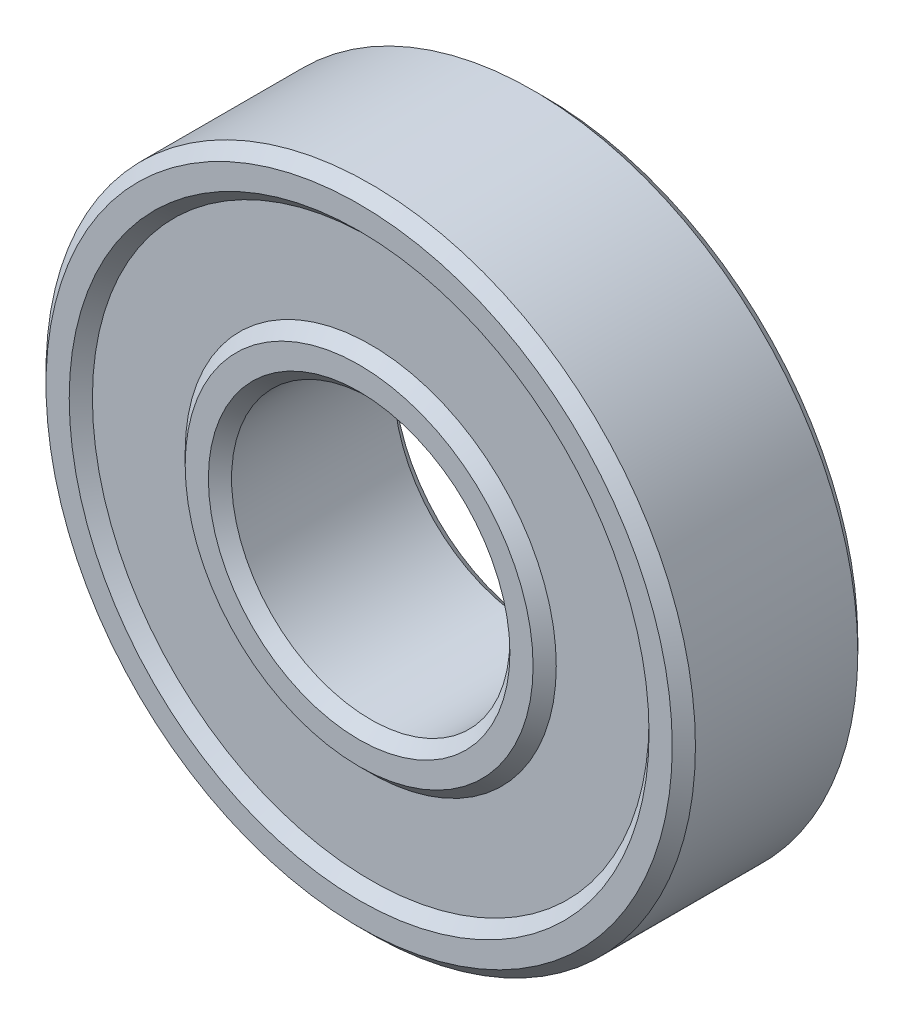
ISO-10303-21;
HEADER;
FILE_DESCRIPTION(('STEP AP214'),'2;1');
FILE_NAME('part.step','',(''),(''),'','','');
FILE_SCHEMA(('AUTOMOTIVE_DESIGN { 1 0 10303 214 1 1 1 1 }'));
ENDSEC;
DATA;
#1=APPLICATION_CONTEXT('core data for automotive mechanical design processes');
#2=APPLICATION_PROTOCOL_DEFINITION('international standard','automotive_design',2000,#1);
#3=PRODUCT_CONTEXT('',#1,'mechanical');
#4=PRODUCT('Part','Part','',(#3));
#5=PRODUCT_RELATED_PRODUCT_CATEGORY('part','',(#4));
#6=PRODUCT_DEFINITION_FORMATION('','',#4);
#7=PRODUCT_DEFINITION_CONTEXT('part definition',#1,'design');
#8=PRODUCT_DEFINITION('design','',#6,#7);
#9=PRODUCT_DEFINITION_SHAPE('','',#8);
#10=(LENGTH_UNIT() NAMED_UNIT(*) SI_UNIT(.MILLI.,.METRE.));
#11=(NAMED_UNIT(*) PLANE_ANGLE_UNIT() SI_UNIT($,.RADIAN.));
#12=(NAMED_UNIT(*) SI_UNIT($,.STERADIAN.) SOLID_ANGLE_UNIT());
#13=UNCERTAINTY_MEASURE_WITH_UNIT(LENGTH_MEASURE(1.E-05),#10,'distance_accuracy_value','');
#14=(GEOMETRIC_REPRESENTATION_CONTEXT(3) GLOBAL_UNCERTAINTY_ASSIGNED_CONTEXT((#13)) GLOBAL_UNIT_ASSIGNED_CONTEXT((#10,
#11,#12)) REPRESENTATION_CONTEXT('',''));
#15=CARTESIAN_POINT('',(0.,0.,0.));
#16=DIRECTION('',(0.,0.,1.));
#17=DIRECTION('',(1.,0.,0.));
#18=AXIS2_PLACEMENT_3D('',#15,#16,#17);
#19=CARTESIAN_POINT('',(0.,0.,4.));
#20=DIRECTION('',(0.,0.,1.));
#21=DIRECTION('',(1.,0.,0.));
#22=AXIS2_PLACEMENT_3D('',#19,#20,#21);
#23=PLANE('',#22);
#24=CARTESIAN_POINT('',(0.,0.,4.));
#25=DIRECTION('',(0.,0.,1.));
#26=DIRECTION('',(1.,0.,0.));
#27=AXIS2_PLACEMENT_3D('',#24,#25,#26);
#28=CIRCLE('',#27,7.5);
#29=CARTESIAN_POINT('',(7.5,0.,4.));
#30=VERTEX_POINT('',#29);
#31=EDGE_CURVE('E69',#30,#30,#28,.T.);
#32=ORIENTED_EDGE('',*,*,#31,.T.);
#33=EDGE_LOOP('',(#32));
#34=FACE_BOUND('',#33,.T.);
#35=CARTESIAN_POINT('',(0.,0.,4.));
#36=DIRECTION('',(0.,0.,1.));
#37=DIRECTION('',(1.,0.,0.));
#38=AXIS2_PLACEMENT_3D('',#35,#36,#37);
#39=CIRCLE('',#38,6.50000000000001);
#40=CARTESIAN_POINT('',(6.50000000000001,0.,4.));
#41=VERTEX_POINT('',#40);
#42=EDGE_CURVE('E72',#41,#41,#39,.F.);
#43=ORIENTED_EDGE('',*,*,#42,.T.);
#44=EDGE_LOOP('',(#43));
#45=FACE_BOUND('',#44,.T.);
#46=ADVANCED_FACE('F49',(#34,#45),#23,.T.);
#47=CARTESIAN_POINT('',(0.,0.,-4.));
#48=DIRECTION('',(0.,0.,1.));
#49=DIRECTION('',(1.,0.,0.));
#50=AXIS2_PLACEMENT_3D('',#47,#48,#49);
#51=PLANE('',#50);
#52=CARTESIAN_POINT('',(0.,0.,-4.));
#53=DIRECTION('',(0.,0.,1.));
#54=DIRECTION('',(1.,0.,0.));
#55=AXIS2_PLACEMENT_3D('',#52,#53,#54);
#56=CIRCLE('',#55,12.5);
#57=CARTESIAN_POINT('',(12.5,0.,-4.));
#58=VERTEX_POINT('',#57);
#59=EDGE_CURVE('E87',#58,#58,#56,.T.);
#60=ORIENTED_EDGE('',*,*,#59,.T.);
#61=EDGE_LOOP('',(#60));
#62=FACE_BOUND('',#61,.T.);
#63=CARTESIAN_POINT('',(0.,0.,-4.));
#64=DIRECTION('',(0.,0.,1.));
#65=DIRECTION('',(1.,0.,0.));
#66=AXIS2_PLACEMENT_3D('',#63,#64,#65);
#67=CIRCLE('',#66,13.5);
#68=CARTESIAN_POINT('',(13.5,0.,-4.));
#69=VERTEX_POINT('',#68);
#70=EDGE_CURVE('E90',#69,#69,#67,.F.);
#71=ORIENTED_EDGE('',*,*,#70,.T.);
#72=EDGE_LOOP('',(#71));
#73=FACE_BOUND('',#72,.T.);
#74=ADVANCED_FACE('F132',(#62,#73),#51,.F.);
#75=CARTESIAN_POINT('',(0.,0.,4.));
#76=DIRECTION('',(0.,0.,1.));
#77=DIRECTION('',(1.,0.,0.));
#78=AXIS2_PLACEMENT_3D('',#75,#76,#77);
#79=CIRCLE('',#78,12.5);
#80=CARTESIAN_POINT('',(12.5,0.,4.));
#81=VERTEX_POINT('',#80);
#82=EDGE_CURVE('E60',#81,#81,#79,.F.);
#83=ORIENTED_EDGE('',*,*,#82,.T.);
#84=EDGE_LOOP('',(#83));
#85=FACE_BOUND('',#84,.T.);
#86=CARTESIAN_POINT('',(0.,0.,4.));
#87=DIRECTION('',(0.,0.,1.));
#88=DIRECTION('',(1.,0.,0.));
#89=AXIS2_PLACEMENT_3D('',#86,#87,#88);
#90=CIRCLE('',#89,13.5);
#91=CARTESIAN_POINT('',(13.5,0.,4.));
#92=VERTEX_POINT('',#91);
#93=EDGE_CURVE('E64',#92,#92,#90,.T.);
#94=ORIENTED_EDGE('',*,*,#93,.T.);
#95=EDGE_LOOP('',(#94));
#96=FACE_BOUND('',#95,.T.);
#97=ADVANCED_FACE('F135',(#85,#96),#23,.T.);
#98=CARTESIAN_POINT('',(0.,0.,-4.));
#99=DIRECTION('',(0.,0.,1.));
#100=DIRECTION('',(1.,0.,0.));
#101=AXIS2_PLACEMENT_3D('',#98,#99,#100);
#102=CIRCLE('',#101,6.5);
#103=CARTESIAN_POINT('',(6.5,0.,-4.));
#104=VERTEX_POINT('',#103);
#105=EDGE_CURVE('E81',#104,#104,#102,.T.);
#106=ORIENTED_EDGE('',*,*,#105,.T.);
#107=EDGE_LOOP('',(#106));
#108=FACE_BOUND('',#107,.T.);
#109=CARTESIAN_POINT('',(0.,0.,-4.));
#110=DIRECTION('',(0.,0.,1.));
#111=DIRECTION('',(1.,0.,0.));
#112=AXIS2_PLACEMENT_3D('',#109,#110,#111);
#113=CIRCLE('',#112,7.5);
#114=CARTESIAN_POINT('',(7.5,0.,-4.));
#115=VERTEX_POINT('',#114);
#116=EDGE_CURVE('E84',#115,#115,#113,.F.);
#117=ORIENTED_EDGE('',*,*,#116,.T.);
#118=EDGE_LOOP('',(#117));
#119=FACE_BOUND('',#118,.T.);
#120=ADVANCED_FACE('F141',(#108,#119),#51,.F.);
#121=CARTESIAN_POINT('',(0.,0.,4.));
#122=DIRECTION('',(0.,0.,-1.));
#123=DIRECTION('',(-1.,0.,0.));
#124=AXIS2_PLACEMENT_3D('',#121,#122,#123);
#125=CYLINDRICAL_SURFACE('',#124,14.);
#126=CARTESIAN_POINT('',(0.,0.,-3.50000000000001));
#127=DIRECTION('',(0.,0.,1.));
#128=DIRECTION('',(1.,0.,0.));
#129=AXIS2_PLACEMENT_3D('',#126,#127,#128);
#130=CIRCLE('',#129,14.);
#131=CARTESIAN_POINT('',(14.,0.,-3.50000000000001));
#132=VERTEX_POINT('',#131);
#133=EDGE_CURVE('E11',#132,#132,#130,.T.);
#134=ORIENTED_EDGE('',*,*,#133,.T.);
#135=EDGE_LOOP('',(#134));
#136=FACE_BOUND('',#135,.T.);
#137=CARTESIAN_POINT('',(0.,0.,3.5));
#138=DIRECTION('',(0.,0.,1.));
#139=DIRECTION('',(1.,0.,0.));
#140=AXIS2_PLACEMENT_3D('',#137,#138,#139);
#141=CIRCLE('',#140,14.);
#142=CARTESIAN_POINT('',(14.,0.,3.5));
#143=VERTEX_POINT('',#142);
#144=EDGE_CURVE('E56',#143,#143,#141,.F.);
#145=ORIENTED_EDGE('',*,*,#144,.T.);
#146=EDGE_LOOP('',(#145));
#147=FACE_BOUND('',#146,.T.);
#148=ADVANCED_FACE('F149',(#136,#147),#125,.T.);
#149=CARTESIAN_POINT('',(0.,0.,4.));
#150=DIRECTION('',(0.,0.,-1.));
#151=DIRECTION('',(-1.,0.,0.));
#152=AXIS2_PLACEMENT_3D('',#149,#150,#151);
#153=CYLINDRICAL_SURFACE('',#152,6.);
#154=CARTESIAN_POINT('',(0.,0.,-3.5));
#155=DIRECTION('',(0.,0.,1.));
#156=DIRECTION('',(1.,0.,0.));
#157=AXIS2_PLACEMENT_3D('',#154,#155,#156);
#158=CIRCLE('',#157,6.);
#159=CARTESIAN_POINT('',(6.,0.,-3.5));
#160=VERTEX_POINT('',#159);
#161=EDGE_CURVE('E75',#160,#160,#158,.F.);
#162=ORIENTED_EDGE('',*,*,#161,.T.);
#163=EDGE_LOOP('',(#162));
#164=FACE_BOUND('',#163,.T.);
#165=CARTESIAN_POINT('',(0.,0.,3.5));
#166=DIRECTION('',(0.,0.,1.));
#167=DIRECTION('',(1.,0.,0.));
#168=AXIS2_PLACEMENT_3D('',#165,#166,#167);
#169=CIRCLE('',#168,6.);
#170=CARTESIAN_POINT('',(6.,0.,3.5));
#171=VERTEX_POINT('',#170);
#172=EDGE_CURVE('E78',#171,#171,#169,.T.);
#173=ORIENTED_EDGE('',*,*,#172,.T.);
#174=EDGE_LOOP('',(#173));
#175=FACE_BOUND('',#174,.T.);
#176=ADVANCED_FACE('F215',(#164,#175),#153,.F.);
#177=CARTESIAN_POINT('',(0.,0.,-3.5));
#178=DIRECTION('',(0.,0.,1.));
#179=DIRECTION('',(1.,0.,0.));
#180=AXIS2_PLACEMENT_3D('',#177,#178,#179);
#181=PLANE('',#180);
#182=CARTESIAN_POINT('',(0.,0.,-3.5));
#183=DIRECTION('',(0.,0.,1.));
#184=DIRECTION('',(1.,0.,0.));
#185=AXIS2_PLACEMENT_3D('',#182,#183,#184);
#186=CIRCLE('',#185,12.);
#187=CARTESIAN_POINT('',(12.,0.,-3.5));
#188=VERTEX_POINT('',#187);
#189=EDGE_CURVE('E93',#188,#188,#186,.T.);
#190=ORIENTED_EDGE('',*,*,#189,.F.);
#191=EDGE_LOOP('',(#190));
#192=FACE_BOUND('',#191,.T.);
#193=CARTESIAN_POINT('',(0.,0.,-3.5));
#194=DIRECTION('',(0.,0.,1.));
#195=DIRECTION('',(1.,0.,0.));
#196=AXIS2_PLACEMENT_3D('',#193,#194,#195);
#197=CIRCLE('',#196,8.);
#198=CARTESIAN_POINT('',(8.,0.,-3.5));
#199=VERTEX_POINT('',#198);
#200=EDGE_CURVE('E96',#199,#199,#197,.T.);
#201=ORIENTED_EDGE('',*,*,#200,.T.);
#202=EDGE_LOOP('',(#201));
#203=FACE_BOUND('',#202,.T.);
#204=ADVANCED_FACE('F113',(#192,#203),#181,.F.);
#205=CARTESIAN_POINT('',(0.,0.,3.5));
#206=DIRECTION('',(0.,0.,1.));
#207=DIRECTION('',(1.,0.,0.));
#208=AXIS2_PLACEMENT_3D('',#205,#206,#207);
#209=PLANE('',#208);
#210=CARTESIAN_POINT('',(0.,0.,3.5));
#211=DIRECTION('',(0.,0.,1.));
#212=DIRECTION('',(1.,0.,0.));
#213=AXIS2_PLACEMENT_3D('',#210,#211,#212);
#214=CIRCLE('',#213,8.);
#215=CARTESIAN_POINT('',(8.,0.,3.5));
#216=VERTEX_POINT('',#215);
#217=EDGE_CURVE('E102',#216,#216,#214,.T.);
#218=ORIENTED_EDGE('',*,*,#217,.F.);
#219=EDGE_LOOP('',(#218));
#220=FACE_BOUND('',#219,.T.);
#221=CARTESIAN_POINT('',(0.,0.,3.5));
#222=DIRECTION('',(0.,0.,1.));
#223=DIRECTION('',(1.,0.,0.));
#224=AXIS2_PLACEMENT_3D('',#221,#222,#223);
#225=CIRCLE('',#224,12.);
#226=CARTESIAN_POINT('',(12.,0.,3.5));
#227=VERTEX_POINT('',#226);
#228=EDGE_CURVE('E99',#227,#227,#225,.T.);
#229=ORIENTED_EDGE('',*,*,#228,.T.);
#230=EDGE_LOOP('',(#229));
#231=FACE_BOUND('',#230,.T.);
#232=ADVANCED_FACE('F109',(#220,#231),#209,.T.);
#233=CARTESIAN_POINT('',(0.,0.,-4.));
#234=DIRECTION('',(0.,0.,-1.));
#235=DIRECTION('',(-1.,0.,0.));
#236=AXIS2_PLACEMENT_3D('',#233,#234,#235);
#237=CONICAL_SURFACE('',#236,12.5,0.785398163397447);
#238=ORIENTED_EDGE('',*,*,#189,.T.);
#239=EDGE_LOOP('',(#238));
#240=FACE_BOUND('',#239,.T.);
#241=ORIENTED_EDGE('',*,*,#59,.F.);
#242=EDGE_LOOP('',(#241));
#243=FACE_BOUND('',#242,.T.);
#244=ADVANCED_FACE('F112',(#240,#243),#237,.F.);
#245=CARTESIAN_POINT('',(0.,0.,-4.));
#246=DIRECTION('',(0.,0.,-1.));
#247=DIRECTION('',(-1.,0.,0.));
#248=AXIS2_PLACEMENT_3D('',#245,#246,#247);
#249=CONICAL_SURFACE('',#248,6.5,0.785398163397446);
#250=ORIENTED_EDGE('',*,*,#161,.F.);
#251=EDGE_LOOP('',(#250));
#252=FACE_BOUND('',#251,.T.);
#253=ORIENTED_EDGE('',*,*,#105,.F.);
#254=EDGE_LOOP('',(#253));
#255=FACE_BOUND('',#254,.T.);
#256=ADVANCED_FACE('F190',(#252,#255),#249,.F.);
#257=CARTESIAN_POINT('',(0.,0.,-3.5));
#258=DIRECTION('',(0.,0.,1.));
#259=DIRECTION('',(1.,0.,0.));
#260=AXIS2_PLACEMENT_3D('',#257,#258,#259);
#261=CONICAL_SURFACE('',#260,8.,0.785398163397452);
#262=ORIENTED_EDGE('',*,*,#116,.F.);
#263=EDGE_LOOP('',(#262));
#264=FACE_BOUND('',#263,.T.);
#265=ORIENTED_EDGE('',*,*,#200,.F.);
#266=EDGE_LOOP('',(#265));
#267=FACE_BOUND('',#266,.T.);
#268=ADVANCED_FACE('F181',(#264,#267),#261,.T.);
#269=CARTESIAN_POINT('',(0.,0.,4.));
#270=DIRECTION('',(0.,0.,-1.));
#271=DIRECTION('',(-1.,0.,0.));
#272=AXIS2_PLACEMENT_3D('',#269,#270,#271);
#273=CONICAL_SURFACE('',#272,7.5,0.785398163397452);
#274=ORIENTED_EDGE('',*,*,#217,.T.);
#275=EDGE_LOOP('',(#274));
#276=FACE_BOUND('',#275,.T.);
#277=ORIENTED_EDGE('',*,*,#31,.F.);
#278=EDGE_LOOP('',(#277));
#279=FACE_BOUND('',#278,.T.);
#280=ADVANCED_FACE('F106',(#276,#279),#273,.T.);
#281=CARTESIAN_POINT('',(0.,0.,3.5));
#282=DIRECTION('',(0.,0.,1.));
#283=DIRECTION('',(1.,0.,0.));
#284=AXIS2_PLACEMENT_3D('',#281,#282,#283);
#285=CONICAL_SURFACE('',#284,6.,0.785398163397455);
#286=ORIENTED_EDGE('',*,*,#42,.F.);
#287=EDGE_LOOP('',(#286));
#288=FACE_BOUND('',#287,.T.);
#289=ORIENTED_EDGE('',*,*,#172,.F.);
#290=EDGE_LOOP('',(#289));
#291=FACE_BOUND('',#290,.T.);
#292=ADVANCED_FACE('F120',(#288,#291),#285,.F.);
#293=CARTESIAN_POINT('',(0.,0.,3.5));
#294=DIRECTION('',(0.,0.,1.));
#295=DIRECTION('',(1.,0.,0.));
#296=AXIS2_PLACEMENT_3D('',#293,#294,#295);
#297=CONICAL_SURFACE('',#296,12.,0.785398163397448);
#298=ORIENTED_EDGE('',*,*,#82,.F.);
#299=EDGE_LOOP('',(#298));
#300=FACE_BOUND('',#299,.T.);
#301=ORIENTED_EDGE('',*,*,#228,.F.);
#302=EDGE_LOOP('',(#301));
#303=FACE_BOUND('',#302,.T.);
#304=ADVANCED_FACE('F117',(#300,#303),#297,.F.);
#305=CARTESIAN_POINT('',(0.,0.,-3.50000000000001));
#306=DIRECTION('',(0.,0.,1.));
#307=DIRECTION('',(1.,0.,0.));
#308=AXIS2_PLACEMENT_3D('',#305,#306,#307);
#309=CONICAL_SURFACE('',#308,14.,0.785398163397452);
#310=ORIENTED_EDGE('',*,*,#70,.F.);
#311=EDGE_LOOP('',(#310));
#312=FACE_BOUND('',#311,.T.);
#313=ORIENTED_EDGE('',*,*,#133,.F.);
#314=EDGE_LOOP('',(#313));
#315=FACE_BOUND('',#314,.T.);
#316=ADVANCED_FACE('F119',(#312,#315),#309,.T.);
#317=CARTESIAN_POINT('',(0.,0.,4.));
#318=DIRECTION('',(0.,0.,-1.));
#319=DIRECTION('',(-1.,0.,0.));
#320=AXIS2_PLACEMENT_3D('',#317,#318,#319);
#321=CONICAL_SURFACE('',#320,13.5,0.785398163397445);
#322=ORIENTED_EDGE('',*,*,#144,.F.);
#323=EDGE_LOOP('',(#322));
#324=FACE_BOUND('',#323,.T.);
#325=ORIENTED_EDGE('',*,*,#93,.F.);
#326=EDGE_LOOP('',(#325));
#327=FACE_BOUND('',#326,.T.);
#328=ADVANCED_FACE('F51',(#324,#327),#321,.T.);
#329=CLOSED_SHELL('',(#46,#74,#97,#120,#148,#176,#204,#232,#244,#256,#268,#280,#292,#304,#316,#328));
#330=MANIFOLD_SOLID_BREP('B2',#329);
#331=ADVANCED_BREP_SHAPE_REPRESENTATION('',(#18,#330),#14);
#332=SHAPE_DEFINITION_REPRESENTATION(#9,#331);
ENDSEC;
END-ISO-10303-21;
